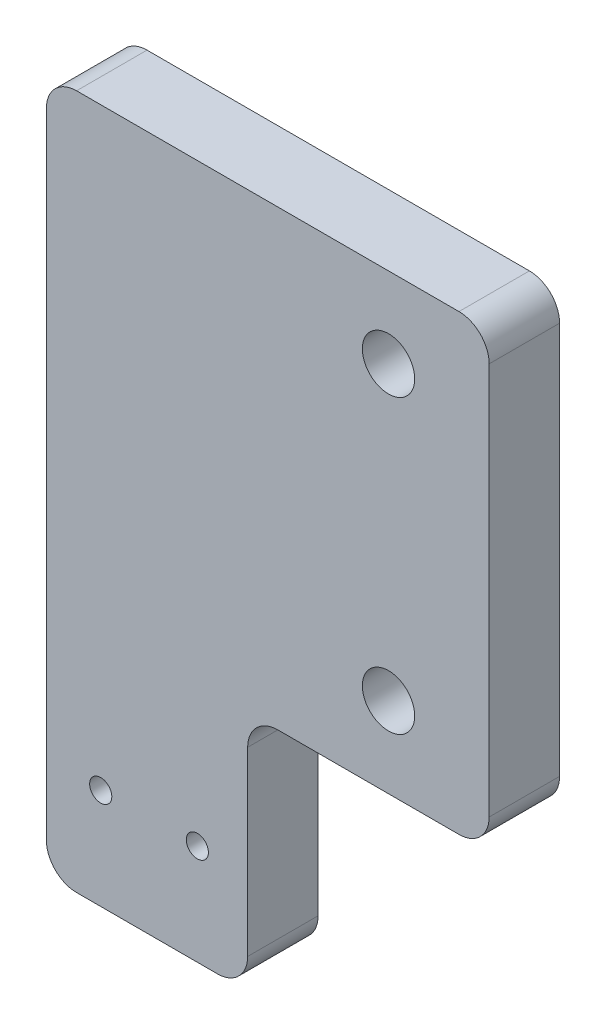
ISO-10303-21;
HEADER;
FILE_DESCRIPTION(('STEP AP214'),'2;1');
FILE_NAME('part.step','',(''),(''),'','','');
FILE_SCHEMA(('AUTOMOTIVE_DESIGN { 1 0 10303 214 1 1 1 1 }'));
ENDSEC;
DATA;
#1=APPLICATION_CONTEXT('core data for automotive mechanical design processes');
#2=APPLICATION_PROTOCOL_DEFINITION('international standard','automotive_design',2000,#1);
#3=PRODUCT_CONTEXT('',#1,'mechanical');
#4=PRODUCT('Part','Part','',(#3));
#5=PRODUCT_RELATED_PRODUCT_CATEGORY('part','',(#4));
#6=PRODUCT_DEFINITION_FORMATION('','',#4);
#7=PRODUCT_DEFINITION_CONTEXT('part definition',#1,'design');
#8=PRODUCT_DEFINITION('design','',#6,#7);
#9=PRODUCT_DEFINITION_SHAPE('','',#8);
#10=(LENGTH_UNIT() NAMED_UNIT(*) SI_UNIT(.MILLI.,.METRE.));
#11=(NAMED_UNIT(*) PLANE_ANGLE_UNIT() SI_UNIT($,.RADIAN.));
#12=(NAMED_UNIT(*) SI_UNIT($,.STERADIAN.) SOLID_ANGLE_UNIT());
#13=UNCERTAINTY_MEASURE_WITH_UNIT(LENGTH_MEASURE(1.E-05),#10,'distance_accuracy_value','');
#14=(GEOMETRIC_REPRESENTATION_CONTEXT(3) GLOBAL_UNCERTAINTY_ASSIGNED_CONTEXT((#13)) GLOBAL_UNIT_ASSIGNED_CONTEXT((#10,
#11,#12)) REPRESENTATION_CONTEXT('',''));
#15=CARTESIAN_POINT('',(0.,0.,0.));
#16=DIRECTION('',(0.,0.,1.));
#17=DIRECTION('',(1.,0.,0.));
#18=AXIS2_PLACEMENT_3D('',#15,#16,#17);
#19=CARTESIAN_POINT('',(40.9999999999999,-42.,7.));
#20=DIRECTION('',(0.,0.,-1.));
#21=DIRECTION('',(-1.,0.,0.));
#22=AXIS2_PLACEMENT_3D('',#19,#20,#21);
#23=PLANE('',#22);
#24=CARTESIAN_POINT('',(15.0000000000001,-59.,7.));
#25=DIRECTION('',(0.,0.,1.));
#26=DIRECTION('',(1.,0.,0.));
#27=AXIS2_PLACEMENT_3D('',#24,#25,#26);
#28=CIRCLE('',#27,1.09999999999997);
#29=CARTESIAN_POINT('',(16.1000000000001,-59.,7.));
#30=VERTEX_POINT('',#29);
#31=EDGE_CURVE('E292',#30,#30,#28,.T.);
#32=ORIENTED_EDGE('',*,*,#31,.F.);
#33=EDGE_LOOP('',(#32));
#34=FACE_BOUND('',#33,.T.);
#35=CARTESIAN_POINT('',(34.,-8.,7.));
#36=DIRECTION('',(0.,0.,1.));
#37=DIRECTION('',(1.,0.,0.));
#38=AXIS2_PLACEMENT_3D('',#35,#36,#37);
#39=CIRCLE('',#38,2.6);
#40=CARTESIAN_POINT('',(36.6,-8.,7.));
#41=VERTEX_POINT('',#40);
#42=EDGE_CURVE('E158',#41,#41,#39,.T.);
#43=ORIENTED_EDGE('',*,*,#42,.F.);
#44=EDGE_LOOP('',(#43));
#45=FACE_BOUND('',#44,.T.);
#46=CARTESIAN_POINT('',(40.9999999999999,-42.,7.));
#47=DIRECTION('',(0.,0.,1.));
#48=DIRECTION('',(-1.,0.,0.));
#49=AXIS2_PLACEMENT_3D('',#46,#47,#48);
#50=CIRCLE('',#49,3.00000000000001);
#51=CARTESIAN_POINT('',(40.9999999999999,-45.,7.));
#52=VERTEX_POINT('',#51);
#53=CARTESIAN_POINT('',(43.9999999999999,-42.,7.));
#54=VERTEX_POINT('',#53);
#55=EDGE_CURVE('E177',#52,#54,#50,.T.);
#56=ORIENTED_EDGE('',*,*,#55,.T.);
#57=DIRECTION('',(0.,1.,0.));
#58=VECTOR('',#57,1.);
#59=CARTESIAN_POINT('',(43.9999999999999,-3.,7.));
#60=LINE('',#59,#58);
#61=CARTESIAN_POINT('',(43.9999999999999,-3.,7.));
#62=VERTEX_POINT('',#61);
#63=EDGE_CURVE('E105',#54,#62,#60,.T.);
#64=ORIENTED_EDGE('',*,*,#63,.T.);
#65=CARTESIAN_POINT('',(40.9999999999999,-3.,7.));
#66=DIRECTION('',(0.,0.,1.));
#67=DIRECTION('',(-1.,0.,0.));
#68=AXIS2_PLACEMENT_3D('',#65,#66,#67);
#69=CIRCLE('',#68,3.);
#70=CARTESIAN_POINT('',(40.9999999999999,0.,7.));
#71=VERTEX_POINT('',#70);
#72=EDGE_CURVE('E204',#62,#71,#69,.T.);
#73=ORIENTED_EDGE('',*,*,#72,.T.);
#74=DIRECTION('',(-1.,0.,0.));
#75=VECTOR('',#74,1.);
#76=CARTESIAN_POINT('',(2.99999999999994,0.,7.));
#77=LINE('',#76,#75);
#78=CARTESIAN_POINT('',(2.99999999999994,0.,7.));
#79=VERTEX_POINT('',#78);
#80=EDGE_CURVE('E223',#71,#79,#77,.T.);
#81=ORIENTED_EDGE('',*,*,#80,.T.);
#82=CARTESIAN_POINT('',(2.99999999999994,-3.,7.));
#83=DIRECTION('',(0.,0.,1.));
#84=DIRECTION('',(1.,0.,0.));
#85=AXIS2_PLACEMENT_3D('',#82,#83,#84);
#86=CIRCLE('',#85,3.);
#87=CARTESIAN_POINT('',(0.,-3.,7.));
#88=VERTEX_POINT('',#87);
#89=EDGE_CURVE('E220',#79,#88,#86,.T.);
#90=ORIENTED_EDGE('',*,*,#89,.T.);
#91=DIRECTION('',(0.,-1.,0.));
#92=VECTOR('',#91,1.);
#93=CARTESIAN_POINT('',(0.,-66.,7.));
#94=LINE('',#93,#92);
#95=CARTESIAN_POINT('',(0.,-66.,7.));
#96=VERTEX_POINT('',#95);
#97=EDGE_CURVE('E222',#88,#96,#94,.T.);
#98=ORIENTED_EDGE('',*,*,#97,.T.);
#99=CARTESIAN_POINT('',(3.,-66.,7.));
#100=DIRECTION('',(0.,0.,1.));
#101=DIRECTION('',(1.,0.,0.));
#102=AXIS2_PLACEMENT_3D('',#99,#100,#101);
#103=CIRCLE('',#102,3.);
#104=CARTESIAN_POINT('',(3.,-69.,7.));
#105=VERTEX_POINT('',#104);
#106=EDGE_CURVE('E225',#96,#105,#103,.T.);
#107=ORIENTED_EDGE('',*,*,#106,.T.);
#108=DIRECTION('',(1.,0.,0.));
#109=VECTOR('',#108,1.);
#110=CARTESIAN_POINT('',(3.,-69.,7.));
#111=LINE('',#110,#109);
#112=CARTESIAN_POINT('',(16.9999999999999,-69.,7.));
#113=VERTEX_POINT('',#112);
#114=EDGE_CURVE('E231',#105,#113,#111,.T.);
#115=ORIENTED_EDGE('',*,*,#114,.T.);
#116=CARTESIAN_POINT('',(16.9999999999999,-66.,7.));
#117=DIRECTION('',(0.,0.,1.));
#118=DIRECTION('',(-1.,0.,0.));
#119=AXIS2_PLACEMENT_3D('',#116,#117,#118);
#120=CIRCLE('',#119,3.);
#121=CARTESIAN_POINT('',(19.9999999999999,-66.,7.));
#122=VERTEX_POINT('',#121);
#123=EDGE_CURVE('E136',#113,#122,#120,.T.);
#124=ORIENTED_EDGE('',*,*,#123,.T.);
#125=DIRECTION('',(0.,1.,0.));
#126=VECTOR('',#125,1.);
#127=CARTESIAN_POINT('',(19.9999999999999,-48.,7.));
#128=LINE('',#127,#126);
#129=CARTESIAN_POINT('',(19.9999999999999,-48.,7.));
#130=VERTEX_POINT('',#129);
#131=EDGE_CURVE('E130',#122,#130,#128,.T.);
#132=ORIENTED_EDGE('',*,*,#131,.T.);
#133=CARTESIAN_POINT('',(22.9999999999999,-48.,7.));
#134=DIRECTION('',(0.,0.,-1.));
#135=DIRECTION('',(1.,0.,0.));
#136=AXIS2_PLACEMENT_3D('',#133,#134,#135);
#137=CIRCLE('',#136,3.);
#138=CARTESIAN_POINT('',(22.9999999999999,-45.,7.));
#139=VERTEX_POINT('',#138);
#140=EDGE_CURVE('E134',#130,#139,#137,.T.);
#141=ORIENTED_EDGE('',*,*,#140,.T.);
#142=DIRECTION('',(1.,0.,0.));
#143=VECTOR('',#142,1.);
#144=CARTESIAN_POINT('',(40.9999999999999,-45.,7.));
#145=LINE('',#144,#143);
#146=EDGE_CURVE('E50',#139,#52,#145,.T.);
#147=ORIENTED_EDGE('',*,*,#146,.T.);
#148=EDGE_LOOP('',(#56,#64,#73,#81,#90,#98,#107,#115,#124,#132,#141,#147));
#149=FACE_BOUND('',#148,.T.);
#150=CARTESIAN_POINT('',(34.,-37.,7.));
#151=DIRECTION('',(0.,0.,1.));
#152=DIRECTION('',(1.,0.,0.));
#153=AXIS2_PLACEMENT_3D('',#150,#151,#152);
#154=CIRCLE('',#153,2.6);
#155=CARTESIAN_POINT('',(36.6,-37.,7.));
#156=VERTEX_POINT('',#155);
#157=EDGE_CURVE('E298',#156,#156,#154,.T.);
#158=ORIENTED_EDGE('',*,*,#157,.F.);
#159=EDGE_LOOP('',(#158));
#160=FACE_BOUND('',#159,.T.);
#161=CARTESIAN_POINT('',(5.40000000000013,-59.,7.));
#162=DIRECTION('',(0.,0.,1.));
#163=DIRECTION('',(1.,0.,0.));
#164=AXIS2_PLACEMENT_3D('',#161,#162,#163);
#165=CIRCLE('',#164,1.09999999999999);
#166=CARTESIAN_POINT('',(6.50000000000012,-59.,7.));
#167=VERTEX_POINT('',#166);
#168=EDGE_CURVE('E283',#167,#167,#165,.T.);
#169=ORIENTED_EDGE('',*,*,#168,.F.);
#170=EDGE_LOOP('',(#169));
#171=FACE_BOUND('',#170,.T.);
#172=ADVANCED_FACE('F33',(#34,#45,#149,#160,#171),#23,.F.);
#173=CARTESIAN_POINT('',(40.9999999999999,-42.,0.));
#174=DIRECTION('',(0.,0.,-1.));
#175=DIRECTION('',(-1.,0.,0.));
#176=AXIS2_PLACEMENT_3D('',#173,#174,#175);
#177=PLANE('',#176);
#178=CARTESIAN_POINT('',(15.0000000000001,-59.,0.));
#179=DIRECTION('',(0.,0.,1.));
#180=DIRECTION('',(1.,0.,0.));
#181=AXIS2_PLACEMENT_3D('',#178,#179,#180);
#182=CIRCLE('',#181,1.09999999999997);
#183=CARTESIAN_POINT('',(16.1000000000001,-59.,0.));
#184=VERTEX_POINT('',#183);
#185=EDGE_CURVE('E289',#184,#184,#182,.T.);
#186=ORIENTED_EDGE('',*,*,#185,.T.);
#187=EDGE_LOOP('',(#186));
#188=FACE_BOUND('',#187,.T.);
#189=CARTESIAN_POINT('',(34.,-8.,0.));
#190=DIRECTION('',(0.,0.,1.));
#191=DIRECTION('',(1.,0.,0.));
#192=AXIS2_PLACEMENT_3D('',#189,#190,#191);
#193=CIRCLE('',#192,2.6);
#194=CARTESIAN_POINT('',(36.6,-8.,0.));
#195=VERTEX_POINT('',#194);
#196=EDGE_CURVE('E301',#195,#195,#193,.T.);
#197=ORIENTED_EDGE('',*,*,#196,.T.);
#198=EDGE_LOOP('',(#197));
#199=FACE_BOUND('',#198,.T.);
#200=CARTESIAN_POINT('',(40.9999999999999,-42.,0.));
#201=DIRECTION('',(0.,0.,1.));
#202=DIRECTION('',(-1.,0.,0.));
#203=AXIS2_PLACEMENT_3D('',#200,#201,#202);
#204=CIRCLE('',#203,3.00000000000001);
#205=CARTESIAN_POINT('',(40.9999999999999,-45.,0.));
#206=VERTEX_POINT('',#205);
#207=CARTESIAN_POINT('',(43.9999999999999,-42.,0.));
#208=VERTEX_POINT('',#207);
#209=EDGE_CURVE('E154',#206,#208,#204,.T.);
#210=ORIENTED_EDGE('',*,*,#209,.F.);
#211=DIRECTION('',(1.,0.,0.));
#212=VECTOR('',#211,1.);
#213=CARTESIAN_POINT('',(40.9999999999999,-45.,0.));
#214=LINE('',#213,#212);
#215=CARTESIAN_POINT('',(22.9999999999999,-45.,0.));
#216=VERTEX_POINT('',#215);
#217=EDGE_CURVE('E97',#216,#206,#214,.T.);
#218=ORIENTED_EDGE('',*,*,#217,.F.);
#219=CARTESIAN_POINT('',(22.9999999999999,-48.,0.));
#220=DIRECTION('',(0.,0.,-1.));
#221=DIRECTION('',(1.,0.,0.));
#222=AXIS2_PLACEMENT_3D('',#219,#220,#221);
#223=CIRCLE('',#222,3.);
#224=CARTESIAN_POINT('',(19.9999999999999,-48.,0.));
#225=VERTEX_POINT('',#224);
#226=EDGE_CURVE('E91',#225,#216,#223,.T.);
#227=ORIENTED_EDGE('',*,*,#226,.F.);
#228=DIRECTION('',(0.,1.,0.));
#229=VECTOR('',#228,1.);
#230=CARTESIAN_POINT('',(19.9999999999999,-48.,0.));
#231=LINE('',#230,#229);
#232=CARTESIAN_POINT('',(19.9999999999999,-66.,0.));
#233=VERTEX_POINT('',#232);
#234=EDGE_CURVE('E144',#233,#225,#231,.T.);
#235=ORIENTED_EDGE('',*,*,#234,.F.);
#236=CARTESIAN_POINT('',(16.9999999999999,-66.,0.));
#237=DIRECTION('',(0.,0.,1.));
#238=DIRECTION('',(-1.,0.,0.));
#239=AXIS2_PLACEMENT_3D('',#236,#237,#238);
#240=CIRCLE('',#239,3.);
#241=CARTESIAN_POINT('',(16.9999999999999,-69.,0.));
#242=VERTEX_POINT('',#241);
#243=EDGE_CURVE('E172',#242,#233,#240,.T.);
#244=ORIENTED_EDGE('',*,*,#243,.F.);
#245=DIRECTION('',(1.,0.,0.));
#246=VECTOR('',#245,1.);
#247=CARTESIAN_POINT('',(3.,-69.,0.));
#248=LINE('',#247,#246);
#249=CARTESIAN_POINT('',(3.,-69.,0.));
#250=VERTEX_POINT('',#249);
#251=EDGE_CURVE('E170',#250,#242,#248,.T.);
#252=ORIENTED_EDGE('',*,*,#251,.F.);
#253=CARTESIAN_POINT('',(3.,-66.,0.));
#254=DIRECTION('',(0.,0.,1.));
#255=DIRECTION('',(1.,0.,0.));
#256=AXIS2_PLACEMENT_3D('',#253,#254,#255);
#257=CIRCLE('',#256,3.);
#258=CARTESIAN_POINT('',(0.,-66.,0.));
#259=VERTEX_POINT('',#258);
#260=EDGE_CURVE('E168',#259,#250,#257,.T.);
#261=ORIENTED_EDGE('',*,*,#260,.F.);
#262=DIRECTION('',(0.,-1.,0.));
#263=VECTOR('',#262,1.);
#264=CARTESIAN_POINT('',(0.,-66.,0.));
#265=LINE('',#264,#263);
#266=CARTESIAN_POINT('',(0.,-3.,0.));
#267=VERTEX_POINT('',#266);
#268=EDGE_CURVE('E166',#267,#259,#265,.T.);
#269=ORIENTED_EDGE('',*,*,#268,.F.);
#270=CARTESIAN_POINT('',(2.99999999999994,-3.,0.));
#271=DIRECTION('',(0.,0.,1.));
#272=DIRECTION('',(1.,0.,0.));
#273=AXIS2_PLACEMENT_3D('',#270,#271,#272);
#274=CIRCLE('',#273,3.);
#275=CARTESIAN_POINT('',(2.99999999999994,0.,0.));
#276=VERTEX_POINT('',#275);
#277=EDGE_CURVE('E164',#276,#267,#274,.T.);
#278=ORIENTED_EDGE('',*,*,#277,.F.);
#279=DIRECTION('',(-1.,0.,0.));
#280=VECTOR('',#279,1.);
#281=CARTESIAN_POINT('',(2.99999999999994,0.,0.));
#282=LINE('',#281,#280);
#283=CARTESIAN_POINT('',(40.9999999999999,0.,0.));
#284=VERTEX_POINT('',#283);
#285=EDGE_CURVE('E162',#284,#276,#282,.T.);
#286=ORIENTED_EDGE('',*,*,#285,.F.);
#287=CARTESIAN_POINT('',(40.9999999999999,-3.,0.));
#288=DIRECTION('',(0.,0.,1.));
#289=DIRECTION('',(-1.,0.,0.));
#290=AXIS2_PLACEMENT_3D('',#287,#288,#289);
#291=CIRCLE('',#290,3.);
#292=CARTESIAN_POINT('',(43.9999999999999,-3.,0.));
#293=VERTEX_POINT('',#292);
#294=EDGE_CURVE('E160',#293,#284,#291,.T.);
#295=ORIENTED_EDGE('',*,*,#294,.F.);
#296=DIRECTION('',(0.,1.,0.));
#297=VECTOR('',#296,1.);
#298=CARTESIAN_POINT('',(43.9999999999999,-3.,0.));
#299=LINE('',#298,#297);
#300=EDGE_CURVE('E157',#208,#293,#299,.T.);
#301=ORIENTED_EDGE('',*,*,#300,.F.);
#302=EDGE_LOOP('',(#210,#218,#227,#235,#244,#252,#261,#269,#278,#286,#295,#301));
#303=FACE_BOUND('',#302,.T.);
#304=CARTESIAN_POINT('',(34.,-37.,0.));
#305=DIRECTION('',(0.,0.,1.));
#306=DIRECTION('',(1.,0.,0.));
#307=AXIS2_PLACEMENT_3D('',#304,#305,#306);
#308=CIRCLE('',#307,2.6);
#309=CARTESIAN_POINT('',(36.6,-37.,0.));
#310=VERTEX_POINT('',#309);
#311=EDGE_CURVE('E295',#310,#310,#308,.T.);
#312=ORIENTED_EDGE('',*,*,#311,.T.);
#313=EDGE_LOOP('',(#312));
#314=FACE_BOUND('',#313,.T.);
#315=CARTESIAN_POINT('',(5.40000000000013,-59.,0.));
#316=DIRECTION('',(0.,0.,1.));
#317=DIRECTION('',(1.,0.,0.));
#318=AXIS2_PLACEMENT_3D('',#315,#316,#317);
#319=CIRCLE('',#318,1.09999999999999);
#320=CARTESIAN_POINT('',(6.50000000000012,-59.,0.));
#321=VERTEX_POINT('',#320);
#322=EDGE_CURVE('E286',#321,#321,#319,.T.);
#323=ORIENTED_EDGE('',*,*,#322,.T.);
#324=EDGE_LOOP('',(#323));
#325=FACE_BOUND('',#324,.T.);
#326=ADVANCED_FACE('F208',(#188,#199,#303,#314,#325),#177,.T.);
#327=CARTESIAN_POINT('',(40.9999999999999,-42.,7.));
#328=DIRECTION('',(0.,0.,-1.));
#329=DIRECTION('',(-1.,0.,0.));
#330=AXIS2_PLACEMENT_3D('',#327,#328,#329);
#331=CYLINDRICAL_SURFACE('',#330,3.00000000000001);
#332=ORIENTED_EDGE('',*,*,#209,.T.);
#333=DIRECTION('',(0.,0.,-1.));
#334=VECTOR('',#333,1.);
#335=CARTESIAN_POINT('',(43.9999999999999,-42.,7.));
#336=LINE('',#335,#334);
#337=EDGE_CURVE('E11',#54,#208,#336,.T.);
#338=ORIENTED_EDGE('',*,*,#337,.F.);
#339=ORIENTED_EDGE('',*,*,#55,.F.);
#340=DIRECTION('',(0.,0.,-1.));
#341=VECTOR('',#340,1.);
#342=CARTESIAN_POINT('',(40.9999999999999,-45.,7.));
#343=LINE('',#342,#341);
#344=EDGE_CURVE('E150',#52,#206,#343,.T.);
#345=ORIENTED_EDGE('',*,*,#344,.T.);
#346=EDGE_LOOP('',(#332,#338,#339,#345));
#347=FACE_BOUND('',#346,.T.);
#348=ADVANCED_FACE('F35',(#347),#331,.T.);
#349=CARTESIAN_POINT('',(43.9999999999999,-3.,7.));
#350=DIRECTION('',(-1.,0.,0.));
#351=DIRECTION('',(0.,-1.,0.));
#352=AXIS2_PLACEMENT_3D('',#349,#350,#351);
#353=PLANE('',#352);
#354=ORIENTED_EDGE('',*,*,#300,.T.);
#355=DIRECTION('',(0.,0.,-1.));
#356=VECTOR('',#355,1.);
#357=CARTESIAN_POINT('',(43.9999999999999,-3.,7.));
#358=LINE('',#357,#356);
#359=EDGE_CURVE('E42',#62,#293,#358,.T.);
#360=ORIENTED_EDGE('',*,*,#359,.F.);
#361=ORIENTED_EDGE('',*,*,#63,.F.);
#362=ORIENTED_EDGE('',*,*,#337,.T.);
#363=EDGE_LOOP('',(#354,#360,#361,#362));
#364=FACE_BOUND('',#363,.T.);
#365=ADVANCED_FACE('F410',(#364),#353,.F.);
#366=CARTESIAN_POINT('',(40.9999999999999,-3.,7.));
#367=DIRECTION('',(0.,0.,-1.));
#368=DIRECTION('',(-1.,0.,0.));
#369=AXIS2_PLACEMENT_3D('',#366,#367,#368);
#370=CYLINDRICAL_SURFACE('',#369,3.);
#371=ORIENTED_EDGE('',*,*,#294,.T.);
#372=DIRECTION('',(0.,0.,-1.));
#373=VECTOR('',#372,1.);
#374=CARTESIAN_POINT('',(40.9999999999999,0.,7.));
#375=LINE('',#374,#373);
#376=EDGE_CURVE('E196',#71,#284,#375,.T.);
#377=ORIENTED_EDGE('',*,*,#376,.F.);
#378=ORIENTED_EDGE('',*,*,#72,.F.);
#379=ORIENTED_EDGE('',*,*,#359,.T.);
#380=EDGE_LOOP('',(#371,#377,#378,#379));
#381=FACE_BOUND('',#380,.T.);
#382=ADVANCED_FACE('F202',(#381),#370,.T.);
#383=CARTESIAN_POINT('',(2.99999999999994,0.,7.));
#384=DIRECTION('',(0.,-1.,0.));
#385=DIRECTION('',(0.,0.,-1.));
#386=AXIS2_PLACEMENT_3D('',#383,#384,#385);
#387=PLANE('',#386);
#388=ORIENTED_EDGE('',*,*,#285,.T.);
#389=DIRECTION('',(0.,0.,-1.));
#390=VECTOR('',#389,1.);
#391=CARTESIAN_POINT('',(2.99999999999994,0.,7.));
#392=LINE('',#391,#390);
#393=EDGE_CURVE('E193',#79,#276,#392,.T.);
#394=ORIENTED_EDGE('',*,*,#393,.F.);
#395=ORIENTED_EDGE('',*,*,#80,.F.);
#396=ORIENTED_EDGE('',*,*,#376,.T.);
#397=EDGE_LOOP('',(#388,#394,#395,#396));
#398=FACE_BOUND('',#397,.T.);
#399=ADVANCED_FACE('F214',(#398),#387,.F.);
#400=CARTESIAN_POINT('',(2.99999999999994,-3.,7.));
#401=DIRECTION('',(0.,0.,-1.));
#402=DIRECTION('',(-1.,0.,0.));
#403=AXIS2_PLACEMENT_3D('',#400,#401,#402);
#404=CYLINDRICAL_SURFACE('',#403,3.);
#405=ORIENTED_EDGE('',*,*,#277,.T.);
#406=DIRECTION('',(0.,0.,-1.));
#407=VECTOR('',#406,1.);
#408=CARTESIAN_POINT('',(0.,-3.,7.));
#409=LINE('',#408,#407);
#410=EDGE_CURVE('E190',#88,#267,#409,.T.);
#411=ORIENTED_EDGE('',*,*,#410,.F.);
#412=ORIENTED_EDGE('',*,*,#89,.F.);
#413=ORIENTED_EDGE('',*,*,#393,.T.);
#414=EDGE_LOOP('',(#405,#411,#412,#413));
#415=FACE_BOUND('',#414,.T.);
#416=ADVANCED_FACE('F218',(#415),#404,.T.);
#417=CARTESIAN_POINT('',(0.,-66.,7.));
#418=DIRECTION('',(1.,0.,0.));
#419=DIRECTION('',(0.,1.,0.));
#420=AXIS2_PLACEMENT_3D('',#417,#418,#419);
#421=PLANE('',#420);
#422=ORIENTED_EDGE('',*,*,#268,.T.);
#423=DIRECTION('',(0.,0.,-1.));
#424=VECTOR('',#423,1.);
#425=CARTESIAN_POINT('',(0.,-66.,7.));
#426=LINE('',#425,#424);
#427=EDGE_CURVE('E187',#96,#259,#426,.T.);
#428=ORIENTED_EDGE('',*,*,#427,.F.);
#429=ORIENTED_EDGE('',*,*,#97,.F.);
#430=ORIENTED_EDGE('',*,*,#410,.T.);
#431=EDGE_LOOP('',(#422,#428,#429,#430));
#432=FACE_BOUND('',#431,.T.);
#433=ADVANCED_FACE('F375',(#432),#421,.F.);
#434=CARTESIAN_POINT('',(3.,-66.,7.));
#435=DIRECTION('',(0.,0.,-1.));
#436=DIRECTION('',(-1.,0.,0.));
#437=AXIS2_PLACEMENT_3D('',#434,#435,#436);
#438=CYLINDRICAL_SURFACE('',#437,3.);
#439=ORIENTED_EDGE('',*,*,#260,.T.);
#440=DIRECTION('',(0.,0.,-1.));
#441=VECTOR('',#440,1.);
#442=CARTESIAN_POINT('',(3.,-69.,7.));
#443=LINE('',#442,#441);
#444=EDGE_CURVE('E184',#105,#250,#443,.T.);
#445=ORIENTED_EDGE('',*,*,#444,.F.);
#446=ORIENTED_EDGE('',*,*,#106,.F.);
#447=ORIENTED_EDGE('',*,*,#427,.T.);
#448=EDGE_LOOP('',(#439,#445,#446,#447));
#449=FACE_BOUND('',#448,.T.);
#450=ADVANCED_FACE('F366',(#449),#438,.T.);
#451=CARTESIAN_POINT('',(3.,-69.,7.));
#452=DIRECTION('',(0.,1.,0.));
#453=DIRECTION('',(0.,0.,1.));
#454=AXIS2_PLACEMENT_3D('',#451,#452,#453);
#455=PLANE('',#454);
#456=ORIENTED_EDGE('',*,*,#251,.T.);
#457=DIRECTION('',(0.,0.,-1.));
#458=VECTOR('',#457,1.);
#459=CARTESIAN_POINT('',(16.9999999999999,-69.,7.));
#460=LINE('',#459,#458);
#461=EDGE_CURVE('E181',#113,#242,#460,.T.);
#462=ORIENTED_EDGE('',*,*,#461,.F.);
#463=ORIENTED_EDGE('',*,*,#114,.F.);
#464=ORIENTED_EDGE('',*,*,#444,.T.);
#465=EDGE_LOOP('',(#456,#462,#463,#464));
#466=FACE_BOUND('',#465,.T.);
#467=ADVANCED_FACE('F237',(#466),#455,.F.);
#468=CARTESIAN_POINT('',(16.9999999999999,-66.,7.));
#469=DIRECTION('',(0.,0.,-1.));
#470=DIRECTION('',(-1.,0.,0.));
#471=AXIS2_PLACEMENT_3D('',#468,#469,#470);
#472=CYLINDRICAL_SURFACE('',#471,3.);
#473=ORIENTED_EDGE('',*,*,#243,.T.);
#474=DIRECTION('',(0.,0.,-1.));
#475=VECTOR('',#474,1.);
#476=CARTESIAN_POINT('',(19.9999999999999,-66.,7.));
#477=LINE('',#476,#475);
#478=EDGE_CURVE('E145',#122,#233,#477,.T.);
#479=ORIENTED_EDGE('',*,*,#478,.F.);
#480=ORIENTED_EDGE('',*,*,#123,.F.);
#481=ORIENTED_EDGE('',*,*,#461,.T.);
#482=EDGE_LOOP('',(#473,#479,#480,#481));
#483=FACE_BOUND('',#482,.T.);
#484=ADVANCED_FACE('F241',(#483),#472,.T.);
#485=CARTESIAN_POINT('',(19.9999999999999,-48.,7.));
#486=DIRECTION('',(-1.,0.,0.));
#487=DIRECTION('',(0.,-1.,0.));
#488=AXIS2_PLACEMENT_3D('',#485,#486,#487);
#489=PLANE('',#488);
#490=ORIENTED_EDGE('',*,*,#234,.T.);
#491=DIRECTION('',(0.,0.,-1.));
#492=VECTOR('',#491,1.);
#493=CARTESIAN_POINT('',(19.9999999999999,-48.,7.));
#494=LINE('',#493,#492);
#495=EDGE_CURVE('E141',#130,#225,#494,.T.);
#496=ORIENTED_EDGE('',*,*,#495,.F.);
#497=ORIENTED_EDGE('',*,*,#131,.F.);
#498=ORIENTED_EDGE('',*,*,#478,.T.);
#499=EDGE_LOOP('',(#490,#496,#497,#498));
#500=FACE_BOUND('',#499,.T.);
#501=ADVANCED_FACE('F142',(#500),#489,.F.);
#502=CARTESIAN_POINT('',(22.9999999999999,-48.,7.));
#503=DIRECTION('',(0.,0.,-1.));
#504=DIRECTION('',(-1.,0.,0.));
#505=AXIS2_PLACEMENT_3D('',#502,#503,#504);
#506=CYLINDRICAL_SURFACE('',#505,3.);
#507=ORIENTED_EDGE('',*,*,#226,.T.);
#508=DIRECTION('',(0.,0.,-1.));
#509=VECTOR('',#508,1.);
#510=CARTESIAN_POINT('',(22.9999999999999,-45.,7.));
#511=LINE('',#510,#509);
#512=EDGE_CURVE('E146',#139,#216,#511,.T.);
#513=ORIENTED_EDGE('',*,*,#512,.F.);
#514=ORIENTED_EDGE('',*,*,#140,.F.);
#515=ORIENTED_EDGE('',*,*,#495,.T.);
#516=EDGE_LOOP('',(#507,#513,#514,#515));
#517=FACE_BOUND('',#516,.T.);
#518=ADVANCED_FACE('F148',(#517),#506,.F.);
#519=CARTESIAN_POINT('',(40.9999999999999,-45.,7.));
#520=DIRECTION('',(0.,1.,0.));
#521=DIRECTION('',(0.,0.,1.));
#522=AXIS2_PLACEMENT_3D('',#519,#520,#521);
#523=PLANE('',#522);
#524=ORIENTED_EDGE('',*,*,#217,.T.);
#525=ORIENTED_EDGE('',*,*,#344,.F.);
#526=ORIENTED_EDGE('',*,*,#146,.F.);
#527=ORIENTED_EDGE('',*,*,#512,.T.);
#528=EDGE_LOOP('',(#524,#525,#526,#527));
#529=FACE_BOUND('',#528,.T.);
#530=ADVANCED_FACE('F245',(#529),#523,.F.);
#531=CARTESIAN_POINT('',(34.,-8.,7.));
#532=DIRECTION('',(0.,0.,-1.));
#533=DIRECTION('',(-1.,0.,0.));
#534=AXIS2_PLACEMENT_3D('',#531,#532,#533);
#535=CYLINDRICAL_SURFACE('',#534,2.6);
#536=ORIENTED_EDGE('',*,*,#42,.T.);
#537=EDGE_LOOP('',(#536));
#538=FACE_BOUND('',#537,.T.);
#539=ORIENTED_EDGE('',*,*,#196,.F.);
#540=EDGE_LOOP('',(#539));
#541=FACE_BOUND('',#540,.T.);
#542=ADVANCED_FACE('F247',(#538,#541),#535,.F.);
#543=CARTESIAN_POINT('',(34.,-37.,7.));
#544=DIRECTION('',(0.,0.,-1.));
#545=DIRECTION('',(-1.,0.,0.));
#546=AXIS2_PLACEMENT_3D('',#543,#544,#545);
#547=CYLINDRICAL_SURFACE('',#546,2.6);
#548=ORIENTED_EDGE('',*,*,#157,.T.);
#549=EDGE_LOOP('',(#548));
#550=FACE_BOUND('',#549,.T.);
#551=ORIENTED_EDGE('',*,*,#311,.F.);
#552=EDGE_LOOP('',(#551));
#553=FACE_BOUND('',#552,.T.);
#554=ADVANCED_FACE('F253',(#550,#553),#547,.F.);
#555=CARTESIAN_POINT('',(15.0000000000001,-59.,7.));
#556=DIRECTION('',(0.,0.,-1.));
#557=DIRECTION('',(-1.,0.,0.));
#558=AXIS2_PLACEMENT_3D('',#555,#556,#557);
#559=CYLINDRICAL_SURFACE('',#558,1.09999999999997);
#560=ORIENTED_EDGE('',*,*,#31,.T.);
#561=EDGE_LOOP('',(#560));
#562=FACE_BOUND('',#561,.T.);
#563=ORIENTED_EDGE('',*,*,#185,.F.);
#564=EDGE_LOOP('',(#563));
#565=FACE_BOUND('',#564,.T.);
#566=ADVANCED_FACE('F270',(#562,#565),#559,.F.);
#567=CARTESIAN_POINT('',(5.40000000000013,-59.,7.));
#568=DIRECTION('',(0.,0.,-1.));
#569=DIRECTION('',(-1.,0.,0.));
#570=AXIS2_PLACEMENT_3D('',#567,#568,#569);
#571=CYLINDRICAL_SURFACE('',#570,1.09999999999999);
#572=ORIENTED_EDGE('',*,*,#168,.T.);
#573=EDGE_LOOP('',(#572));
#574=FACE_BOUND('',#573,.T.);
#575=ORIENTED_EDGE('',*,*,#322,.F.);
#576=EDGE_LOOP('',(#575));
#577=FACE_BOUND('',#576,.T.);
#578=ADVANCED_FACE('F274',(#574,#577),#571,.F.);
#579=CLOSED_SHELL('',(#172,#326,#348,#365,#382,#399,#416,#433,#450,#467,#484,#501,#518,#530,
#542,#554,#566,#578));
#580=MANIFOLD_SOLID_BREP('B2',#579);
#581=ADVANCED_BREP_SHAPE_REPRESENTATION('',(#18,#580),#14);
#582=SHAPE_DEFINITION_REPRESENTATION(#9,#581);
ENDSEC;
END-ISO-10303-21;
